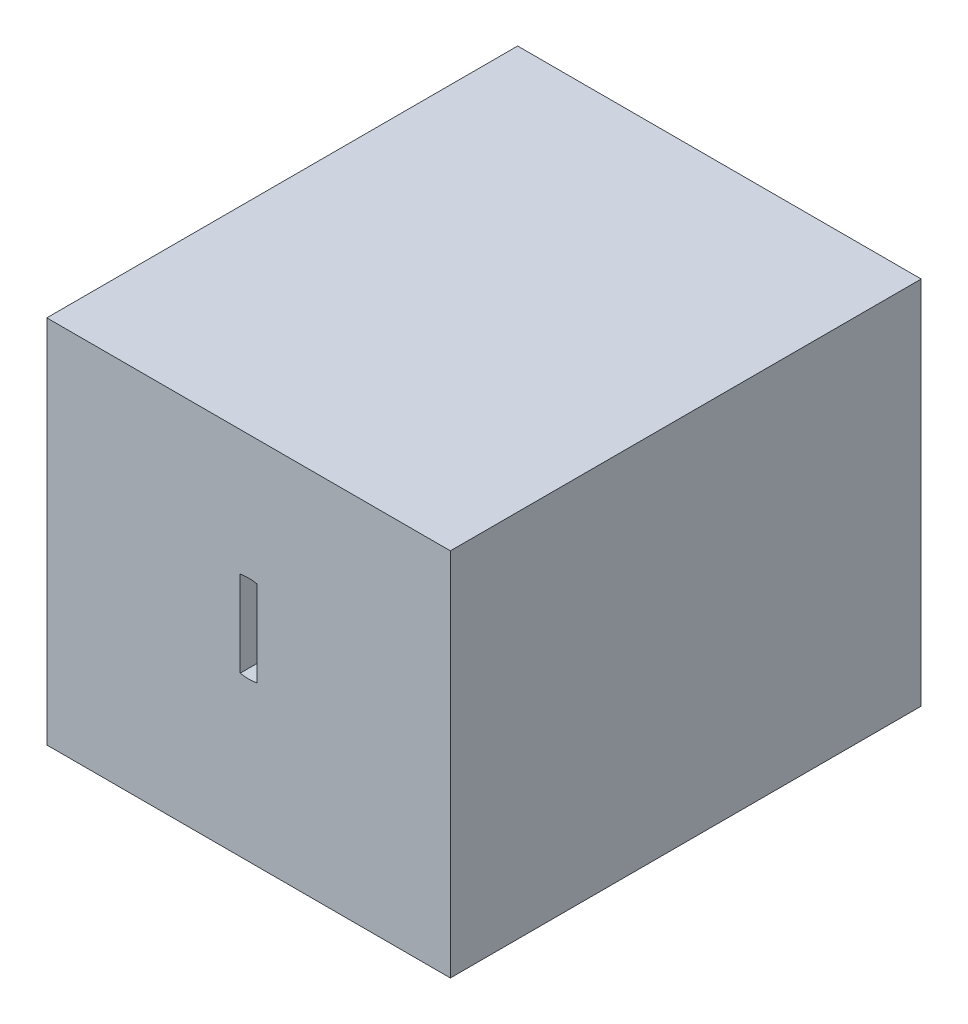
ISO-10303-21;
HEADER;
FILE_DESCRIPTION(('STEP AP214'),'2;1');
FILE_NAME('part.step','',(''),(''),'','','');
FILE_SCHEMA(('AUTOMOTIVE_DESIGN { 1 0 10303 214 1 1 1 1 }'));
ENDSEC;
DATA;
#1=APPLICATION_CONTEXT('core data for automotive mechanical design processes');
#2=APPLICATION_PROTOCOL_DEFINITION('international standard','automotive_design',2000,#1);
#3=PRODUCT_CONTEXT('',#1,'mechanical');
#4=PRODUCT('Part','Part','',(#3));
#5=PRODUCT_RELATED_PRODUCT_CATEGORY('part','',(#4));
#6=PRODUCT_DEFINITION_FORMATION('','',#4);
#7=PRODUCT_DEFINITION_CONTEXT('part definition',#1,'design');
#8=PRODUCT_DEFINITION('design','',#6,#7);
#9=PRODUCT_DEFINITION_SHAPE('','',#8);
#10=(LENGTH_UNIT() NAMED_UNIT(*) SI_UNIT(.MILLI.,.METRE.));
#11=(NAMED_UNIT(*) PLANE_ANGLE_UNIT() SI_UNIT($,.RADIAN.));
#12=(NAMED_UNIT(*) SI_UNIT($,.STERADIAN.) SOLID_ANGLE_UNIT());
#13=UNCERTAINTY_MEASURE_WITH_UNIT(LENGTH_MEASURE(1.E-05),#10,'distance_accuracy_value','');
#14=(GEOMETRIC_REPRESENTATION_CONTEXT(3) GLOBAL_UNCERTAINTY_ASSIGNED_CONTEXT((#13)) GLOBAL_UNIT_ASSIGNED_CONTEXT((#10,
#11,#12)) REPRESENTATION_CONTEXT('',''));
#15=CARTESIAN_POINT('',(0.,0.,0.));
#16=DIRECTION('',(0.,0.,1.));
#17=DIRECTION('',(1.,0.,0.));
#18=AXIS2_PLACEMENT_3D('',#15,#16,#17);
#19=CARTESIAN_POINT('',(-32.8183082101523,-7.19214017713193,-54.7013246195609));
#20=DIRECTION('',(0.,-1.,0.));
#21=DIRECTION('',(0.,0.,-1.));
#22=AXIS2_PLACEMENT_3D('',#19,#20,#21);
#23=PLANE('',#22);
#24=DIRECTION('',(-1.,0.,0.));
#25=VECTOR('',#24,1.);
#26=CARTESIAN_POINT('',(-32.8183082101523,-7.19214017713193,-62.2013246195609));
#27=LINE('',#26,#25);
#28=CARTESIAN_POINT('',(-32.8183082101523,-7.19214017713193,-62.2013246195609));
#29=VERTEX_POINT('',#28);
#30=CARTESIAN_POINT('',(-33.8933082101523,-7.19214017713193,-62.2013246195608));
#31=VERTEX_POINT('',#30);
#32=EDGE_CURVE('E422',#29,#31,#27,.T.);
#33=ORIENTED_EDGE('',*,*,#32,.T.);
#34=DIRECTION('',(0.,0.,1.));
#35=VECTOR('',#34,1.);
#36=CARTESIAN_POINT('',(-33.8933082101523,-7.19214017713193,-58.7013246195608));
#37=LINE('',#36,#35);
#38=CARTESIAN_POINT('',(-33.8933082101523,-7.19214017713193,-58.7013246195608));
#39=VERTEX_POINT('',#38);
#40=EDGE_CURVE('E282',#31,#39,#37,.T.);
#41=ORIENTED_EDGE('',*,*,#40,.T.);
#42=DIRECTION('',(0.,0.,-1.));
#43=VECTOR('',#42,1.);
#44=CARTESIAN_POINT('',(-33.8933082101523,-7.19214017713193,-54.7013246195609));
#45=LINE('',#44,#43);
#46=CARTESIAN_POINT('',(-33.8933082101523,-7.19214017713193,-54.7013246195608));
#47=VERTEX_POINT('',#46);
#48=EDGE_CURVE('E368',#47,#39,#45,.T.);
#49=ORIENTED_EDGE('',*,*,#48,.F.);
#50=DIRECTION('',(-1.,0.,0.));
#51=VECTOR('',#50,1.);
#52=CARTESIAN_POINT('',(-32.8183082101523,-7.19214017713193,-54.7013246195609));
#53=LINE('',#52,#51);
#54=CARTESIAN_POINT('',(-32.8183082101523,-7.19214017713193,-54.7013246195609));
#55=VERTEX_POINT('',#54);
#56=EDGE_CURVE('E398',#55,#47,#53,.T.);
#57=ORIENTED_EDGE('',*,*,#56,.F.);
#58=DIRECTION('',(0.,0.,-1.));
#59=VECTOR('',#58,1.);
#60=CARTESIAN_POINT('',(-32.8183082101523,-7.19214017713193,-54.7013246195609));
#61=LINE('',#60,#59);
#62=EDGE_CURVE('E445',#55,#29,#61,.T.);
#63=ORIENTED_EDGE('',*,*,#62,.T.);
#64=EDGE_LOOP('',(#33,#41,#49,#57,#63));
#65=FACE_BOUND('',#64,.T.);
#66=ADVANCED_FACE('F37',(#65),#23,.F.);
#67=DIRECTION('',(0.,0.,1.));
#68=VECTOR('',#67,1.);
#69=CARTESIAN_POINT('',(-38.0933082101523,-7.19214017713193,-54.7013246195609));
#70=LINE('',#69,#68);
#71=CARTESIAN_POINT('',(-38.0933082101523,-7.19214017713193,-58.7013246195608));
#72=VERTEX_POINT('',#71);
#73=CARTESIAN_POINT('',(-38.0933082101523,-7.19214017713193,-54.7013246195609));
#74=VERTEX_POINT('',#73);
#75=EDGE_CURVE('E373',#72,#74,#70,.T.);
#76=ORIENTED_EDGE('',*,*,#75,.F.);
#77=DIRECTION('',(0.,0.,-1.));
#78=VECTOR('',#77,1.);
#79=CARTESIAN_POINT('',(-38.0933082101523,-7.19214017713193,-58.7013246195608));
#80=LINE('',#79,#78);
#81=CARTESIAN_POINT('',(-38.0933082101523,-7.19214017713193,-62.2013246195608));
#82=VERTEX_POINT('',#81);
#83=EDGE_CURVE('E294',#72,#82,#80,.T.);
#84=ORIENTED_EDGE('',*,*,#83,.T.);
#85=CARTESIAN_POINT('',(-39.1683082101523,-7.19214017713193,-62.2013246195609));
#86=VERTEX_POINT('',#85);
#87=EDGE_CURVE('E421',#82,#86,#27,.T.);
#88=ORIENTED_EDGE('',*,*,#87,.T.);
#89=DIRECTION('',(0.,0.,-1.));
#90=VECTOR('',#89,1.);
#91=CARTESIAN_POINT('',(-39.1683082101523,-7.19214017713193,-54.7013246195609));
#92=LINE('',#91,#90);
#93=CARTESIAN_POINT('',(-39.1683082101523,-7.19214017713193,-54.7013246195609));
#94=VERTEX_POINT('',#93);
#95=EDGE_CURVE('E442',#94,#86,#92,.T.);
#96=ORIENTED_EDGE('',*,*,#95,.F.);
#97=EDGE_CURVE('E397',#74,#94,#53,.T.);
#98=ORIENTED_EDGE('',*,*,#97,.F.);
#99=EDGE_LOOP('',(#76,#84,#88,#96,#98));
#100=FACE_BOUND('',#99,.T.);
#101=ADVANCED_FACE('F535',(#100),#23,.F.);
#102=DIRECTION('',(-1.,0.,0.));
#103=VECTOR('',#102,1.);
#104=CARTESIAN_POINT('',(-32.8183082101523,-7.19214017713193,-58.7013246195608));
#105=LINE('',#104,#103);
#106=CARTESIAN_POINT('',(-34.2933082101523,-7.19214017713193,-58.7013246195608));
#107=VERTEX_POINT('',#106);
#108=CARTESIAN_POINT('',(-37.6933082101523,-7.19214017713193,-58.7013246195608));
#109=VERTEX_POINT('',#108);
#110=EDGE_CURVE('E376',#107,#109,#105,.T.);
#111=ORIENTED_EDGE('',*,*,#110,.F.);
#112=DIRECTION('',(0.,0.,-1.));
#113=VECTOR('',#112,1.);
#114=CARTESIAN_POINT('',(-34.2933082101523,-7.19214017713193,-58.7013246195608));
#115=LINE('',#114,#113);
#116=CARTESIAN_POINT('',(-34.2933082101523,-7.19214017713193,-62.2013246195608));
#117=VERTEX_POINT('',#116);
#118=EDGE_CURVE('E277',#107,#117,#115,.T.);
#119=ORIENTED_EDGE('',*,*,#118,.T.);
#120=CARTESIAN_POINT('',(-37.6933082101523,-7.19214017713193,-62.2013246195608));
#121=VERTEX_POINT('',#120);
#122=EDGE_CURVE('E426',#117,#121,#27,.T.);
#123=ORIENTED_EDGE('',*,*,#122,.T.);
#124=DIRECTION('',(0.,0.,1.));
#125=VECTOR('',#124,1.);
#126=CARTESIAN_POINT('',(-37.6933082101523,-7.19214017713193,-58.7013246195608));
#127=LINE('',#126,#125);
#128=EDGE_CURVE('E300',#121,#109,#127,.T.);
#129=ORIENTED_EDGE('',*,*,#128,.T.);
#130=EDGE_LOOP('',(#111,#119,#123,#129));
#131=FACE_BOUND('',#130,.T.);
#132=ADVANCED_FACE('F497',(#131),#23,.F.);
#133=CARTESIAN_POINT('',(-33.8183082101523,-0.842140177131929,-54.7013246195609));
#134=DIRECTION('',(0.,1.,0.));
#135=DIRECTION('',(0.,0.,1.));
#136=AXIS2_PLACEMENT_3D('',#133,#134,#135);
#137=PLANE('',#136);
#138=DIRECTION('',(0.,0.,-1.));
#139=VECTOR('',#138,1.);
#140=CARTESIAN_POINT('',(-38.0933082101523,-0.842140177131929,-54.7013246195609));
#141=LINE('',#140,#139);
#142=CARTESIAN_POINT('',(-38.0933082101523,-0.842140177131929,-54.7013246195608));
#143=VERTEX_POINT('',#142);
#144=CARTESIAN_POINT('',(-38.0933082101523,-0.842140177131929,-58.7013246195608));
#145=VERTEX_POINT('',#144);
#146=EDGE_CURVE('E371',#143,#145,#141,.T.);
#147=ORIENTED_EDGE('',*,*,#146,.F.);
#148=DIRECTION('',(1.,0.,0.));
#149=VECTOR('',#148,1.);
#150=CARTESIAN_POINT('',(-38.1683082101523,-0.842140177131929,-54.7013246195609));
#151=LINE('',#150,#149);
#152=CARTESIAN_POINT('',(-39.1683082101523,-0.842140177131929,-54.7013246195609));
#153=VERTEX_POINT('',#152);
#154=EDGE_CURVE('E385',#153,#143,#151,.T.);
#155=ORIENTED_EDGE('',*,*,#154,.F.);
#156=DIRECTION('',(0.,0.,-1.));
#157=VECTOR('',#156,1.);
#158=CARTESIAN_POINT('',(-39.1683082101523,-0.842140177131929,-54.7013246195609));
#159=LINE('',#158,#157);
#160=CARTESIAN_POINT('',(-39.1683082101523,-0.842140177131929,-62.2013246195609));
#161=VERTEX_POINT('',#160);
#162=EDGE_CURVE('E434',#153,#161,#159,.T.);
#163=ORIENTED_EDGE('',*,*,#162,.T.);
#164=DIRECTION('',(1.,0.,0.));
#165=VECTOR('',#164,1.);
#166=CARTESIAN_POINT('',(-33.8183082101523,-0.842140177131929,-62.2013246195609));
#167=LINE('',#166,#165);
#168=CARTESIAN_POINT('',(-32.8183082101523,-0.842140177131929,-62.2013246195609));
#169=VERTEX_POINT('',#168);
#170=EDGE_CURVE('E384',#161,#169,#167,.T.);
#171=ORIENTED_EDGE('',*,*,#170,.T.);
#172=DIRECTION('',(0.,0.,-1.));
#173=VECTOR('',#172,1.);
#174=CARTESIAN_POINT('',(-32.8183082101523,-0.842140177131929,-54.7013246195609));
#175=LINE('',#174,#173);
#176=CARTESIAN_POINT('',(-32.8183082101523,-0.842140177131929,-54.7013246195609));
#177=VERTEX_POINT('',#176);
#178=EDGE_CURVE('E409',#177,#169,#175,.T.);
#179=ORIENTED_EDGE('',*,*,#178,.F.);
#180=CARTESIAN_POINT('',(-33.8933082101523,-0.842140177131929,-54.7013246195609));
#181=VERTEX_POINT('',#180);
#182=EDGE_CURVE('E389',#181,#177,#151,.T.);
#183=ORIENTED_EDGE('',*,*,#182,.F.);
#184=DIRECTION('',(0.,0.,1.));
#185=VECTOR('',#184,1.);
#186=CARTESIAN_POINT('',(-33.8933082101523,-0.842140177131929,-54.7013246195609));
#187=LINE('',#186,#185);
#188=CARTESIAN_POINT('',(-33.8933082101523,-0.842140177131929,-58.7013246195608));
#189=VERTEX_POINT('',#188);
#190=EDGE_CURVE('E343',#189,#181,#187,.T.);
#191=ORIENTED_EDGE('',*,*,#190,.F.);
#192=DIRECTION('',(1.,0.,0.));
#193=VECTOR('',#192,1.);
#194=CARTESIAN_POINT('',(-33.8183082101523,-0.842140177131929,-58.7013246195608));
#195=LINE('',#194,#193);
#196=EDGE_CURVE('E454',#145,#189,#195,.T.);
#197=ORIENTED_EDGE('',*,*,#196,.F.);
#198=EDGE_LOOP('',(#147,#155,#163,#171,#179,#183,#191,#197));
#199=FACE_BOUND('',#198,.T.);
#200=ADVANCED_FACE('F552',(#199),#137,.F.);
#201=CARTESIAN_POINT('',(-35.9933082101523,0.982859822868071,25.7986753804392));
#202=DIRECTION('',(0.,-1.,0.));
#203=DIRECTION('',(0.,0.,-1.));
#204=AXIS2_PLACEMENT_3D('',#201,#202,#203);
#205=PLANE('',#204);
#206=DIRECTION('',(-1.,0.,0.));
#207=VECTOR('',#206,1.);
#208=CARTESIAN_POINT('',(-27.9933082101526,0.982859822868071,-62.2013246195609));
#209=LINE('',#208,#207);
#210=CARTESIAN_POINT('',(-29.9933082101523,0.982859822868071,-62.2013246195609));
#211=VERTEX_POINT('',#210);
#212=CARTESIAN_POINT('',(-41.9933082101523,0.982859822868071,-62.2013246195609));
#213=VERTEX_POINT('',#212);
#214=EDGE_CURVE('E452',#211,#213,#209,.T.);
#215=ORIENTED_EDGE('',*,*,#214,.T.);
#216=DIRECTION('',(0.,0.,1.));
#217=VECTOR('',#216,1.);
#218=CARTESIAN_POINT('',(-41.9933082101523,0.982859822868071,-48.2013246195609));
#219=LINE('',#218,#217);
#220=CARTESIAN_POINT('',(-41.9933082101523,0.982859822868071,-48.2013246195609));
#221=VERTEX_POINT('',#220);
#222=EDGE_CURVE('E249',#213,#221,#219,.T.);
#223=ORIENTED_EDGE('',*,*,#222,.T.);
#224=DIRECTION('',(1.,0.,0.));
#225=VECTOR('',#224,1.);
#226=CARTESIAN_POINT('',(-41.9933082101523,0.982859822868071,-48.2013246195609));
#227=LINE('',#226,#225);
#228=CARTESIAN_POINT('',(-29.9933082101523,0.982859822868071,-48.2013246195609));
#229=VERTEX_POINT('',#228);
#230=EDGE_CURVE('E257',#221,#229,#227,.T.);
#231=ORIENTED_EDGE('',*,*,#230,.T.);
#232=DIRECTION('',(0.,0.,-1.));
#233=VECTOR('',#232,1.);
#234=CARTESIAN_POINT('',(-29.9933082101523,0.982859822868071,-63.1020549371144));
#235=LINE('',#234,#233);
#236=EDGE_CURVE('E238',#229,#211,#235,.T.);
#237=ORIENTED_EDGE('',*,*,#236,.T.);
#238=EDGE_LOOP('',(#215,#223,#231,#237));
#239=FACE_BOUND('',#238,.T.);
#240=ADVANCED_FACE('F264',(#239),#205,.F.);
#241=CARTESIAN_POINT('',(-27.9933082101526,0.982859822868071,-62.2013246195609));
#242=DIRECTION('',(0.,0.,1.));
#243=DIRECTION('',(1.,0.,0.));
#244=AXIS2_PLACEMENT_3D('',#241,#242,#243);
#245=PLANE('',#244);
#246=ORIENTED_EDGE('',*,*,#122,.F.);
#247=DIRECTION('',(1.,0.,0.));
#248=VECTOR('',#247,1.);
#249=CARTESIAN_POINT('',(-27.9933082101526,-7.19214017713196,-62.2013246195609));
#250=LINE('',#249,#248);
#251=EDGE_CURVE('E477',#117,#31,#250,.T.);
#252=ORIENTED_EDGE('',*,*,#251,.T.);
#253=ORIENTED_EDGE('',*,*,#32,.F.);
#254=DIRECTION('',(0.,-1.,0.));
#255=VECTOR('',#254,1.);
#256=CARTESIAN_POINT('',(-32.8183082101523,-4.81714017713193,-62.2013246195609));
#257=LINE('',#256,#255);
#258=CARTESIAN_POINT('',(-32.8183082101523,-4.81714017713193,-62.2013246195609));
#259=VERTEX_POINT('',#258);
#260=EDGE_CURVE('E418',#259,#29,#257,.T.);
#261=ORIENTED_EDGE('',*,*,#260,.F.);
#262=CARTESIAN_POINT('',(-32.8183082101523,-4.01714017713193,-62.2013246195609));
#263=DIRECTION('',(0.,0.,-1.));
#264=DIRECTION('',(-1.,0.,0.));
#265=AXIS2_PLACEMENT_3D('',#262,#263,#264);
#266=CIRCLE('',#265,0.8);
#267=CARTESIAN_POINT('',(-32.8183082101523,-3.21714017713193,-62.2013246195609));
#268=VERTEX_POINT('',#267);
#269=EDGE_CURVE('E415',#268,#259,#266,.T.);
#270=ORIENTED_EDGE('',*,*,#269,.F.);
#271=DIRECTION('',(0.,-1.,0.));
#272=VECTOR('',#271,1.);
#273=CARTESIAN_POINT('',(-32.8183082101523,-1.84214017713193,-62.2013246195609));
#274=LINE('',#273,#272);
#275=EDGE_CURVE('E412',#169,#268,#274,.T.);
#276=ORIENTED_EDGE('',*,*,#275,.F.);
#277=ORIENTED_EDGE('',*,*,#170,.F.);
#278=DIRECTION('',(0.,1.,0.));
#279=VECTOR('',#278,1.);
#280=CARTESIAN_POINT('',(-39.1683082101523,-0.842140177131929,-62.2013246195609));
#281=LINE('',#280,#279);
#282=CARTESIAN_POINT('',(-39.1683082101523,-3.21714017713193,-62.2013246195609));
#283=VERTEX_POINT('',#282);
#284=EDGE_CURVE('E432',#283,#161,#281,.T.);
#285=ORIENTED_EDGE('',*,*,#284,.F.);
#286=CARTESIAN_POINT('',(-39.1683082101523,-4.01714017713193,-62.2013246195609));
#287=DIRECTION('',(0.,0.,-1.));
#288=DIRECTION('',(1.,0.,0.));
#289=AXIS2_PLACEMENT_3D('',#286,#287,#288);
#290=CIRCLE('',#289,0.8);
#291=CARTESIAN_POINT('',(-39.1683082101523,-4.81714017713193,-62.2013246195609));
#292=VERTEX_POINT('',#291);
#293=EDGE_CURVE('E429',#292,#283,#290,.T.);
#294=ORIENTED_EDGE('',*,*,#293,.F.);
#295=DIRECTION('',(0.,1.,0.));
#296=VECTOR('',#295,1.);
#297=CARTESIAN_POINT('',(-39.1683082101523,-4.81714017713193,-62.2013246195609));
#298=LINE('',#297,#296);
#299=EDGE_CURVE('E425',#86,#292,#298,.T.);
#300=ORIENTED_EDGE('',*,*,#299,.F.);
#301=ORIENTED_EDGE('',*,*,#87,.F.);
#302=DIRECTION('',(1.,0.,0.));
#303=VECTOR('',#302,1.);
#304=CARTESIAN_POINT('',(-27.9933082101526,-7.19214017713196,-62.2013246195609));
#305=LINE('',#304,#303);
#306=EDGE_CURVE('E474',#82,#121,#305,.T.);
#307=ORIENTED_EDGE('',*,*,#306,.T.);
#308=EDGE_LOOP('',(#246,#252,#253,#261,#270,#276,#277,#285,#294,#300,#301,#307));
#309=FACE_BOUND('',#308,.T.);
#310=DIRECTION('',(-1.,0.,0.));
#311=VECTOR('',#310,1.);
#312=CARTESIAN_POINT('',(-27.9933082101526,-10.0171401771319,-62.2013246195609));
#313=LINE('',#312,#311);
#314=CARTESIAN_POINT('',(-29.9933082101523,-10.0171401771319,-62.2013246195609));
#315=VERTEX_POINT('',#314);
#316=CARTESIAN_POINT('',(-41.9933082101523,-10.0171401771319,-62.2013246195609));
#317=VERTEX_POINT('',#316);
#318=EDGE_CURVE('E437',#315,#317,#313,.T.);
#319=ORIENTED_EDGE('',*,*,#318,.T.);
#320=DIRECTION('',(0.,1.,0.));
#321=VECTOR('',#320,1.);
#322=CARTESIAN_POINT('',(-41.9933082101523,0.982859822868071,-62.2013246195609));
#323=LINE('',#322,#321);
#324=EDGE_CURVE('E274',#317,#213,#323,.T.);
#325=ORIENTED_EDGE('',*,*,#324,.T.);
#326=ORIENTED_EDGE('',*,*,#214,.F.);
#327=DIRECTION('',(0.,-1.,0.));
#328=VECTOR('',#327,1.);
#329=CARTESIAN_POINT('',(-29.9933082101523,0.982859822868071,-62.2013246195609));
#330=LINE('',#329,#328);
#331=EDGE_CURVE('E244',#211,#315,#330,.T.);
#332=ORIENTED_EDGE('',*,*,#331,.T.);
#333=EDGE_LOOP('',(#319,#325,#326,#332));
#334=FACE_BOUND('',#333,.T.);
#335=ADVANCED_FACE('F499',(#309,#334),#245,.F.);
#336=CARTESIAN_POINT('',(-35.9933082101523,-10.0171401771319,25.7986753804392));
#337=DIRECTION('',(0.,-1.,0.));
#338=DIRECTION('',(0.,0.,-1.));
#339=AXIS2_PLACEMENT_3D('',#336,#337,#338);
#340=PLANE('',#339);
#341=DIRECTION('',(0.,0.,1.));
#342=VECTOR('',#341,1.);
#343=CARTESIAN_POINT('',(-41.9933082101523,-10.0171401771319,-48.2013246195609));
#344=LINE('',#343,#342);
#345=CARTESIAN_POINT('',(-41.9933082101523,-10.0171401771319,-48.2013246195609));
#346=VERTEX_POINT('',#345);
#347=EDGE_CURVE('E250',#317,#346,#344,.T.);
#348=ORIENTED_EDGE('',*,*,#347,.F.);
#349=ORIENTED_EDGE('',*,*,#318,.F.);
#350=DIRECTION('',(0.,0.,-1.));
#351=VECTOR('',#350,1.);
#352=CARTESIAN_POINT('',(-29.9933082101523,-10.0171401771319,-63.1020549371144));
#353=LINE('',#352,#351);
#354=CARTESIAN_POINT('',(-29.9933082101523,-10.0171401771319,-48.2013246195609));
#355=VERTEX_POINT('',#354);
#356=EDGE_CURVE('E266',#355,#315,#353,.T.);
#357=ORIENTED_EDGE('',*,*,#356,.F.);
#358=DIRECTION('',(1.,0.,0.));
#359=VECTOR('',#358,1.);
#360=CARTESIAN_POINT('',(-41.9933082101523,-10.0171401771319,-48.2013246195609));
#361=LINE('',#360,#359);
#362=EDGE_CURVE('E259',#346,#355,#361,.T.);
#363=ORIENTED_EDGE('',*,*,#362,.F.);
#364=EDGE_LOOP('',(#348,#349,#357,#363));
#365=FACE_BOUND('',#364,.T.);
#366=ADVANCED_FACE('F622',(#365),#340,.T.);
#367=CARTESIAN_POINT('',(-29.9933082101523,23.4550648771123,-60.2013246195608));
#368=DIRECTION('',(-1.,0.,0.));
#369=DIRECTION('',(0.,0.,1.));
#370=AXIS2_PLACEMENT_3D('',#367,#368,#369);
#371=PLANE('',#370);
#372=ORIENTED_EDGE('',*,*,#236,.F.);
#373=DIRECTION('',(0.,-1.,0.));
#374=VECTOR('',#373,1.);
#375=CARTESIAN_POINT('',(-29.9933082101523,0.982859822868071,-48.2013246195609));
#376=LINE('',#375,#374);
#377=EDGE_CURVE('E241',#229,#355,#376,.T.);
#378=ORIENTED_EDGE('',*,*,#377,.T.);
#379=ORIENTED_EDGE('',*,*,#356,.T.);
#380=ORIENTED_EDGE('',*,*,#331,.F.);
#381=EDGE_LOOP('',(#372,#378,#379,#380));
#382=FACE_BOUND('',#381,.T.);
#383=ADVANCED_FACE('F240',(#382),#371,.F.);
#384=CARTESIAN_POINT('',(-39.4933082101523,23.4550648771123,-48.2013246195609));
#385=DIRECTION('',(0.,0.,-1.));
#386=DIRECTION('',(-1.,0.,0.));
#387=AXIS2_PLACEMENT_3D('',#384,#385,#386);
#388=PLANE('',#387);
#389=ORIENTED_EDGE('',*,*,#377,.F.);
#390=ORIENTED_EDGE('',*,*,#230,.F.);
#391=DIRECTION('',(0.,-1.,0.));
#392=VECTOR('',#391,1.);
#393=CARTESIAN_POINT('',(-41.9933082101523,0.982859822868071,-48.2013246195609));
#394=LINE('',#393,#392);
#395=EDGE_CURVE('E261',#221,#346,#394,.T.);
#396=ORIENTED_EDGE('',*,*,#395,.T.);
#397=ORIENTED_EDGE('',*,*,#362,.T.);
#398=EDGE_LOOP('',(#389,#390,#396,#397));
#399=FACE_BOUND('',#398,.T.);
#400=DIRECTION('',(0.,-1.,0.));
#401=VECTOR('',#400,1.);
#402=CARTESIAN_POINT('',(-35.7433082101523,-0.0171401771319295,-48.2013246195609));
#403=LINE('',#402,#401);
#404=CARTESIAN_POINT('',(-35.7433082101523,-2.74140509491462,-48.2013246195609));
#405=VERTEX_POINT('',#404);
#406=CARTESIAN_POINT('',(-35.7433082101523,-5.29287525934924,-48.2013246195609));
#407=VERTEX_POINT('',#406);
#408=EDGE_CURVE('E313',#405,#407,#403,.T.);
#409=ORIENTED_EDGE('',*,*,#408,.T.);
#410=CARTESIAN_POINT('',(-35.9933082101523,-4.01714017713193,-48.2013246195609));
#411=DIRECTION('',(0.,0.,-1.));
#412=DIRECTION('',(-1.,0.,0.));
#413=AXIS2_PLACEMENT_3D('',#410,#411,#412);
#414=CIRCLE('',#413,1.3);
#415=CARTESIAN_POINT('',(-36.2433082101523,-5.29287525934924,-48.2013246195609));
#416=VERTEX_POINT('',#415);
#417=EDGE_CURVE('E379',#416,#407,#414,.F.);
#418=ORIENTED_EDGE('',*,*,#417,.F.);
#419=DIRECTION('',(0.,1.,0.));
#420=VECTOR('',#419,1.);
#421=CARTESIAN_POINT('',(-36.2433082101523,-0.0171401771319295,-48.2013246195609));
#422=LINE('',#421,#420);
#423=CARTESIAN_POINT('',(-36.2433082101523,-2.74140509491462,-48.2013246195609));
#424=VERTEX_POINT('',#423);
#425=EDGE_CURVE('E319',#416,#424,#422,.T.);
#426=ORIENTED_EDGE('',*,*,#425,.T.);
#427=EDGE_CURVE('E378',#405,#424,#414,.F.);
#428=ORIENTED_EDGE('',*,*,#427,.F.);
#429=EDGE_LOOP('',(#409,#418,#426,#428));
#430=FACE_BOUND('',#429,.T.);
#431=ADVANCED_FACE('F254',(#399,#430),#388,.F.);
#432=CARTESIAN_POINT('',(-41.9933082101523,23.4550648771123,-60.2013246195608));
#433=DIRECTION('',(1.,0.,0.));
#434=DIRECTION('',(0.,0.,-1.));
#435=AXIS2_PLACEMENT_3D('',#432,#433,#434);
#436=PLANE('',#435);
#437=ORIENTED_EDGE('',*,*,#395,.F.);
#438=ORIENTED_EDGE('',*,*,#222,.F.);
#439=ORIENTED_EDGE('',*,*,#324,.F.);
#440=ORIENTED_EDGE('',*,*,#347,.T.);
#441=EDGE_LOOP('',(#437,#438,#439,#440));
#442=FACE_BOUND('',#441,.T.);
#443=ADVANCED_FACE('F625',(#442),#436,.F.);
#444=CARTESIAN_POINT('',(-39.1683082101523,-0.842140177131929,-54.7013246195609));
#445=DIRECTION('',(-1.,0.,0.));
#446=DIRECTION('',(0.,-1.,0.));
#447=AXIS2_PLACEMENT_3D('',#444,#445,#446);
#448=PLANE('',#447);
#449=ORIENTED_EDGE('',*,*,#284,.T.);
#450=ORIENTED_EDGE('',*,*,#162,.F.);
#451=DIRECTION('',(0.,1.,0.));
#452=VECTOR('',#451,1.);
#453=CARTESIAN_POINT('',(-39.1683082101523,-1.84214017713193,-54.7013246195609));
#454=LINE('',#453,#452);
#455=CARTESIAN_POINT('',(-39.1683082101523,-3.21714017713193,-54.7013246195609));
#456=VERTEX_POINT('',#455);
#457=EDGE_CURVE('E407',#456,#153,#454,.T.);
#458=ORIENTED_EDGE('',*,*,#457,.F.);
#459=DIRECTION('',(0.,0.,-1.));
#460=VECTOR('',#459,1.);
#461=CARTESIAN_POINT('',(-39.1683082101523,-3.21714017713193,-54.7013246195609));
#462=LINE('',#461,#460);
#463=EDGE_CURVE('E438',#456,#283,#462,.T.);
#464=ORIENTED_EDGE('',*,*,#463,.T.);
#465=EDGE_LOOP('',(#449,#450,#458,#464));
#466=FACE_BOUND('',#465,.T.);
#467=ADVANCED_FACE('F547',(#466),#448,.F.);
#468=CARTESIAN_POINT('',(-39.1683082101523,-4.01714017713193,-54.7013246195609));
#469=DIRECTION('',(0.,0.,-1.));
#470=DIRECTION('',(-1.,0.,0.));
#471=AXIS2_PLACEMENT_3D('',#468,#469,#470);
#472=CYLINDRICAL_SURFACE('',#471,0.8);
#473=ORIENTED_EDGE('',*,*,#293,.T.);
#474=ORIENTED_EDGE('',*,*,#463,.F.);
#475=CARTESIAN_POINT('',(-39.1683082101523,-4.01714017713193,-54.7013246195609));
#476=DIRECTION('',(0.,0.,-1.));
#477=DIRECTION('',(1.,0.,0.));
#478=AXIS2_PLACEMENT_3D('',#475,#476,#477);
#479=CIRCLE('',#478,0.8);
#480=CARTESIAN_POINT('',(-39.1683082101523,-4.81714017713193,-54.7013246195609));
#481=VERTEX_POINT('',#480);
#482=EDGE_CURVE('E404',#481,#456,#479,.T.);
#483=ORIENTED_EDGE('',*,*,#482,.F.);
#484=DIRECTION('',(0.,0.,-1.));
#485=VECTOR('',#484,1.);
#486=CARTESIAN_POINT('',(-39.1683082101523,-4.81714017713193,-54.7013246195609));
#487=LINE('',#486,#485);
#488=EDGE_CURVE('E440',#481,#292,#487,.T.);
#489=ORIENTED_EDGE('',*,*,#488,.T.);
#490=EDGE_LOOP('',(#473,#474,#483,#489));
#491=FACE_BOUND('',#490,.T.);
#492=ADVANCED_FACE('F542',(#491),#472,.F.);
#493=CARTESIAN_POINT('',(-39.1683082101523,-4.81714017713193,-54.7013246195609));
#494=DIRECTION('',(-1.,0.,0.));
#495=DIRECTION('',(0.,-1.,0.));
#496=AXIS2_PLACEMENT_3D('',#493,#494,#495);
#497=PLANE('',#496);
#498=ORIENTED_EDGE('',*,*,#299,.T.);
#499=ORIENTED_EDGE('',*,*,#488,.F.);
#500=DIRECTION('',(0.,1.,0.));
#501=VECTOR('',#500,1.);
#502=CARTESIAN_POINT('',(-39.1683082101523,-4.81714017713193,-54.7013246195609));
#503=LINE('',#502,#501);
#504=EDGE_CURVE('E401',#94,#481,#503,.T.);
#505=ORIENTED_EDGE('',*,*,#504,.F.);
#506=ORIENTED_EDGE('',*,*,#95,.T.);
#507=EDGE_LOOP('',(#498,#499,#505,#506));
#508=FACE_BOUND('',#507,.T.);
#509=ADVANCED_FACE('F538',(#508),#497,.F.);
#510=CARTESIAN_POINT('',(-32.8183082101523,-4.81714017713193,-54.7013246195609));
#511=DIRECTION('',(1.,0.,0.));
#512=DIRECTION('',(0.,0.,-1.));
#513=AXIS2_PLACEMENT_3D('',#510,#511,#512);
#514=PLANE('',#513);
#515=ORIENTED_EDGE('',*,*,#260,.T.);
#516=ORIENTED_EDGE('',*,*,#62,.F.);
#517=DIRECTION('',(0.,-1.,0.));
#518=VECTOR('',#517,1.);
#519=CARTESIAN_POINT('',(-32.8183082101523,-4.81714017713193,-54.7013246195609));
#520=LINE('',#519,#518);
#521=CARTESIAN_POINT('',(-32.8183082101523,-4.81714017713193,-54.7013246195609));
#522=VERTEX_POINT('',#521);
#523=EDGE_CURVE('E394',#522,#55,#520,.T.);
#524=ORIENTED_EDGE('',*,*,#523,.F.);
#525=DIRECTION('',(0.,0.,-1.));
#526=VECTOR('',#525,1.);
#527=CARTESIAN_POINT('',(-32.8183082101523,-4.81714017713193,-54.7013246195609));
#528=LINE('',#527,#526);
#529=EDGE_CURVE('E447',#522,#259,#528,.T.);
#530=ORIENTED_EDGE('',*,*,#529,.T.);
#531=EDGE_LOOP('',(#515,#516,#524,#530));
#532=FACE_BOUND('',#531,.T.);
#533=ADVANCED_FACE('F583',(#532),#514,.F.);
#534=CARTESIAN_POINT('',(-32.8183082101523,-4.01714017713193,-54.7013246195609));
#535=DIRECTION('',(0.,0.,-1.));
#536=DIRECTION('',(-1.,0.,0.));
#537=AXIS2_PLACEMENT_3D('',#534,#535,#536);
#538=CYLINDRICAL_SURFACE('',#537,0.8);
#539=ORIENTED_EDGE('',*,*,#269,.T.);
#540=ORIENTED_EDGE('',*,*,#529,.F.);
#541=CARTESIAN_POINT('',(-32.8183082101523,-4.01714017713193,-54.7013246195609));
#542=DIRECTION('',(0.,0.,-1.));
#543=DIRECTION('',(-1.,0.,0.));
#544=AXIS2_PLACEMENT_3D('',#541,#542,#543);
#545=CIRCLE('',#544,0.8);
#546=CARTESIAN_POINT('',(-32.8183082101523,-3.21714017713193,-54.7013246195609));
#547=VERTEX_POINT('',#546);
#548=EDGE_CURVE('E391',#547,#522,#545,.T.);
#549=ORIENTED_EDGE('',*,*,#548,.F.);
#550=DIRECTION('',(0.,0.,-1.));
#551=VECTOR('',#550,1.);
#552=CARTESIAN_POINT('',(-32.8183082101523,-3.21714017713193,-54.7013246195609));
#553=LINE('',#552,#551);
#554=EDGE_CURVE('E449',#547,#268,#553,.T.);
#555=ORIENTED_EDGE('',*,*,#554,.T.);
#556=EDGE_LOOP('',(#539,#540,#549,#555));
#557=FACE_BOUND('',#556,.T.);
#558=ADVANCED_FACE('F579',(#557),#538,.F.);
#559=CARTESIAN_POINT('',(-32.8183082101523,-1.84214017713193,-54.7013246195609));
#560=DIRECTION('',(1.,0.,0.));
#561=DIRECTION('',(0.,1.,0.));
#562=AXIS2_PLACEMENT_3D('',#559,#560,#561);
#563=PLANE('',#562);
#564=ORIENTED_EDGE('',*,*,#275,.T.);
#565=ORIENTED_EDGE('',*,*,#554,.F.);
#566=DIRECTION('',(0.,-1.,0.));
#567=VECTOR('',#566,1.);
#568=CARTESIAN_POINT('',(-32.8183082101523,-0.842140177131929,-54.7013246195609));
#569=LINE('',#568,#567);
#570=EDGE_CURVE('E388',#177,#547,#569,.T.);
#571=ORIENTED_EDGE('',*,*,#570,.F.);
#572=ORIENTED_EDGE('',*,*,#178,.T.);
#573=EDGE_LOOP('',(#564,#565,#571,#572));
#574=FACE_BOUND('',#573,.T.);
#575=ADVANCED_FACE('F575',(#574),#563,.F.);
#576=CARTESIAN_POINT('',(-39.1683082101523,-4.01714017713193,-54.7013246195609));
#577=DIRECTION('',(0.,0.,1.));
#578=DIRECTION('',(1.,0.,0.));
#579=AXIS2_PLACEMENT_3D('',#576,#577,#578);
#580=PLANE('',#579);
#581=CARTESIAN_POINT('',(-35.9933082101523,-4.01714017713193,-54.7013246195609));
#582=DIRECTION('',(0.,0.,-1.));
#583=DIRECTION('',(-1.,0.,0.));
#584=AXIS2_PLACEMENT_3D('',#581,#582,#583);
#585=CIRCLE('',#584,1.3);
#586=CARTESIAN_POINT('',(-37.2933082101523,-4.01714017713193,-54.7013246195609));
#587=VERTEX_POINT('',#586);
#588=EDGE_CURVE('E381',#587,#587,#585,.T.);
#589=ORIENTED_EDGE('',*,*,#588,.F.);
#590=EDGE_LOOP('',(#589));
#591=FACE_BOUND('',#590,.T.);
#592=ORIENTED_EDGE('',*,*,#56,.T.);
#593=DIRECTION('',(0.,1.,0.));
#594=VECTOR('',#593,1.);
#595=CARTESIAN_POINT('',(-33.8933082101523,-13.7921401771319,-54.7013246195608));
#596=LINE('',#595,#594);
#597=CARTESIAN_POINT('',(-33.8933082101523,-7.59214017713193,-54.7013246195608));
#598=VERTEX_POINT('',#597);
#599=EDGE_CURVE('E353',#598,#47,#596,.T.);
#600=ORIENTED_EDGE('',*,*,#599,.F.);
#601=DIRECTION('',(-1.,0.,0.));
#602=VECTOR('',#601,1.);
#603=CARTESIAN_POINT('',(-38.0933082101523,-7.59214017713193,-54.7013246195608));
#604=LINE('',#603,#602);
#605=CARTESIAN_POINT('',(-38.0933082101523,-7.59214017713193,-54.7013246195608));
#606=VERTEX_POINT('',#605);
#607=EDGE_CURVE('E350',#598,#606,#604,.T.);
#608=ORIENTED_EDGE('',*,*,#607,.T.);
#609=DIRECTION('',(0.,1.,0.));
#610=VECTOR('',#609,1.);
#611=CARTESIAN_POINT('',(-38.0933082101523,-13.7921401771319,-54.7013246195608));
#612=LINE('',#611,#610);
#613=EDGE_CURVE('E364',#606,#74,#612,.T.);
#614=ORIENTED_EDGE('',*,*,#613,.T.);
#615=ORIENTED_EDGE('',*,*,#97,.T.);
#616=ORIENTED_EDGE('',*,*,#504,.T.);
#617=ORIENTED_EDGE('',*,*,#482,.T.);
#618=ORIENTED_EDGE('',*,*,#457,.T.);
#619=ORIENTED_EDGE('',*,*,#154,.T.);
#620=CARTESIAN_POINT('',(-38.0933082101523,-0.442140177131929,-54.7013246195608));
#621=VERTEX_POINT('',#620);
#622=EDGE_CURVE('E339',#143,#621,#612,.T.);
#623=ORIENTED_EDGE('',*,*,#622,.T.);
#624=DIRECTION('',(-1.,0.,0.));
#625=VECTOR('',#624,1.);
#626=CARTESIAN_POINT('',(-38.0933082101523,-0.442140177131929,-54.7013246195608));
#627=LINE('',#626,#625);
#628=CARTESIAN_POINT('',(-33.8933082101523,-0.442140177131929,-54.7013246195608));
#629=VERTEX_POINT('',#628);
#630=EDGE_CURVE('E336',#629,#621,#627,.T.);
#631=ORIENTED_EDGE('',*,*,#630,.F.);
#632=EDGE_CURVE('E362',#181,#629,#596,.T.);
#633=ORIENTED_EDGE('',*,*,#632,.F.);
#634=ORIENTED_EDGE('',*,*,#182,.T.);
#635=ORIENTED_EDGE('',*,*,#570,.T.);
#636=ORIENTED_EDGE('',*,*,#548,.T.);
#637=ORIENTED_EDGE('',*,*,#523,.T.);
#638=EDGE_LOOP('',(#592,#600,#608,#614,#615,#616,#617,#618,#619,#623,#631,#633,#634,#635,#636,#637));
#639=FACE_BOUND('',#638,.T.);
#640=ADVANCED_FACE('F523',(#591,#639),#580,.F.);
#641=CARTESIAN_POINT('',(-35.9933082101523,-4.01714017713193,62.7996753804392));
#642=DIRECTION('',(0.,0.,-1.));
#643=DIRECTION('',(-1.,0.,0.));
#644=AXIS2_PLACEMENT_3D('',#641,#642,#643);
#645=CYLINDRICAL_SURFACE('',#644,1.3);
#646=ORIENTED_EDGE('',*,*,#588,.T.);
#647=EDGE_LOOP('',(#646));
#648=FACE_BOUND('',#647,.T.);
#649=CARTESIAN_POINT('',(-35.9933082101523,-4.01714017713193,-49.2013246195609));
#650=DIRECTION('',(0.,0.,1.));
#651=DIRECTION('',(1.,0.,0.));
#652=AXIS2_PLACEMENT_3D('',#649,#650,#651);
#653=CIRCLE('',#652,1.3);
#654=CARTESIAN_POINT('',(-35.7433082101523,-2.74140509491462,-49.2013246195609));
#655=VERTEX_POINT('',#654);
#656=CARTESIAN_POINT('',(-35.7433082101523,-5.29287525934924,-49.2013246195609));
#657=VERTEX_POINT('',#656);
#658=EDGE_CURVE('E466',#655,#657,#653,.F.);
#659=ORIENTED_EDGE('',*,*,#658,.F.);
#660=DIRECTION('',(0.,0.,-1.));
#661=VECTOR('',#660,1.);
#662=CARTESIAN_POINT('',(-35.7433082101523,-2.74140509491462,62.7996753804392));
#663=LINE('',#662,#661);
#664=EDGE_CURVE('E471',#655,#405,#663,.F.);
#665=ORIENTED_EDGE('',*,*,#664,.T.);
#666=ORIENTED_EDGE('',*,*,#427,.T.);
#667=DIRECTION('',(0.,0.,-1.));
#668=VECTOR('',#667,1.);
#669=CARTESIAN_POINT('',(-36.2433082101523,-2.74140509491462,62.7996753804392));
#670=LINE('',#669,#668);
#671=CARTESIAN_POINT('',(-36.2433082101523,-2.74140509491462,-49.2013246195609));
#672=VERTEX_POINT('',#671);
#673=EDGE_CURVE('E461',#424,#672,#670,.T.);
#674=ORIENTED_EDGE('',*,*,#673,.T.);
#675=CARTESIAN_POINT('',(-35.9933082101523,-4.01714017713193,-49.2013246195609));
#676=DIRECTION('',(0.,0.,1.));
#677=DIRECTION('',(1.,0.,0.));
#678=AXIS2_PLACEMENT_3D('',#675,#676,#677);
#679=CIRCLE('',#678,1.3);
#680=CARTESIAN_POINT('',(-36.2433082101523,-5.29287525934924,-49.2013246195609));
#681=VERTEX_POINT('',#680);
#682=EDGE_CURVE('E458',#681,#672,#679,.F.);
#683=ORIENTED_EDGE('',*,*,#682,.F.);
#684=DIRECTION('',(0.,0.,-1.));
#685=VECTOR('',#684,1.);
#686=CARTESIAN_POINT('',(-36.2433082101523,-5.29287525934924,62.7996753804392));
#687=LINE('',#686,#685);
#688=EDGE_CURVE('E463',#681,#416,#687,.F.);
#689=ORIENTED_EDGE('',*,*,#688,.T.);
#690=ORIENTED_EDGE('',*,*,#417,.T.);
#691=DIRECTION('',(0.,0.,-1.));
#692=VECTOR('',#691,1.);
#693=CARTESIAN_POINT('',(-35.7433082101523,-5.29287525934924,62.7996753804392));
#694=LINE('',#693,#692);
#695=EDGE_CURVE('E469',#407,#657,#694,.T.);
#696=ORIENTED_EDGE('',*,*,#695,.T.);
#697=EDGE_LOOP('',(#659,#665,#666,#674,#683,#689,#690,#696));
#698=FACE_BOUND('',#697,.T.);
#699=ADVANCED_FACE('F749',(#648,#698),#645,.F.);
#700=CARTESIAN_POINT('',(-35.9933082101523,-0.442140177131929,25.7986753804392));
#701=DIRECTION('',(0.,-1.,0.));
#702=DIRECTION('',(0.,0.,-1.));
#703=AXIS2_PLACEMENT_3D('',#700,#701,#702);
#704=PLANE('',#703);
#705=DIRECTION('',(0.,0.,-1.));
#706=VECTOR('',#705,1.);
#707=CARTESIAN_POINT('',(-38.0933082101523,-0.442140177131929,-54.7013246195608));
#708=LINE('',#707,#706);
#709=CARTESIAN_POINT('',(-38.0933082101523,-0.442140177131929,-58.7013246195608));
#710=VERTEX_POINT('',#709);
#711=EDGE_CURVE('E325',#621,#710,#708,.T.);
#712=ORIENTED_EDGE('',*,*,#711,.T.);
#713=DIRECTION('',(1.,0.,0.));
#714=VECTOR('',#713,1.);
#715=CARTESIAN_POINT('',(-38.0933082101523,-0.442140177131929,-58.7013246195608));
#716=LINE('',#715,#714);
#717=CARTESIAN_POINT('',(-33.8933082101523,-0.442140177131929,-58.7013246195608));
#718=VERTEX_POINT('',#717);
#719=EDGE_CURVE('E330',#710,#718,#716,.T.);
#720=ORIENTED_EDGE('',*,*,#719,.T.);
#721=DIRECTION('',(0.,0.,1.));
#722=VECTOR('',#721,1.);
#723=CARTESIAN_POINT('',(-33.8933082101523,-0.442140177131929,-54.7013246195608));
#724=LINE('',#723,#722);
#725=EDGE_CURVE('E333',#718,#629,#724,.T.);
#726=ORIENTED_EDGE('',*,*,#725,.T.);
#727=ORIENTED_EDGE('',*,*,#630,.T.);
#728=EDGE_LOOP('',(#712,#720,#726,#727));
#729=FACE_BOUND('',#728,.T.);
#730=ADVANCED_FACE('F565',(#729),#704,.T.);
#731=CARTESIAN_POINT('',(-33.8933082101523,-13.7921401771319,-54.7013246195608));
#732=DIRECTION('',(-1.,0.,0.));
#733=DIRECTION('',(0.,0.,1.));
#734=AXIS2_PLACEMENT_3D('',#731,#732,#733);
#735=PLANE('',#734);
#736=ORIENTED_EDGE('',*,*,#190,.T.);
#737=ORIENTED_EDGE('',*,*,#632,.T.);
#738=ORIENTED_EDGE('',*,*,#725,.F.);
#739=DIRECTION('',(0.,1.,0.));
#740=VECTOR('',#739,1.);
#741=CARTESIAN_POINT('',(-33.8933082101523,-13.7921401771319,-58.7013246195608));
#742=LINE('',#741,#740);
#743=EDGE_CURVE('E357',#189,#718,#742,.T.);
#744=ORIENTED_EDGE('',*,*,#743,.F.);
#745=EDGE_LOOP('',(#736,#737,#738,#744));
#746=FACE_BOUND('',#745,.T.);
#747=ADVANCED_FACE('F570',(#746),#735,.T.);
#748=CARTESIAN_POINT('',(-38.0933082101523,-13.7921401771319,-58.7013246195608));
#749=DIRECTION('',(0.,0.,1.));
#750=DIRECTION('',(1.,0.,0.));
#751=AXIS2_PLACEMENT_3D('',#748,#749,#750);
#752=PLANE('',#751);
#753=ORIENTED_EDGE('',*,*,#196,.T.);
#754=ORIENTED_EDGE('',*,*,#743,.T.);
#755=ORIENTED_EDGE('',*,*,#719,.F.);
#756=DIRECTION('',(0.,1.,0.));
#757=VECTOR('',#756,1.);
#758=CARTESIAN_POINT('',(-38.0933082101523,-13.7921401771319,-58.7013246195608));
#759=LINE('',#758,#757);
#760=EDGE_CURVE('E358',#145,#710,#759,.T.);
#761=ORIENTED_EDGE('',*,*,#760,.F.);
#762=EDGE_LOOP('',(#753,#754,#755,#761));
#763=FACE_BOUND('',#762,.T.);
#764=ADVANCED_FACE('F561',(#763),#752,.T.);
#765=CARTESIAN_POINT('',(-38.0933082101523,-13.7921401771319,-54.7013246195608));
#766=DIRECTION('',(1.,0.,0.));
#767=DIRECTION('',(0.,0.,-1.));
#768=AXIS2_PLACEMENT_3D('',#765,#766,#767);
#769=PLANE('',#768);
#770=ORIENTED_EDGE('',*,*,#146,.T.);
#771=ORIENTED_EDGE('',*,*,#760,.T.);
#772=ORIENTED_EDGE('',*,*,#711,.F.);
#773=ORIENTED_EDGE('',*,*,#622,.F.);
#774=EDGE_LOOP('',(#770,#771,#772,#773));
#775=FACE_BOUND('',#774,.T.);
#776=ADVANCED_FACE('F557',(#775),#769,.T.);
#777=CARTESIAN_POINT('',(-33.8933082101523,-7.59214017713193,-58.7013246195608));
#778=VERTEX_POINT('',#777);
#779=EDGE_CURVE('E359',#778,#39,#742,.T.);
#780=ORIENTED_EDGE('',*,*,#779,.T.);
#781=DIRECTION('',(0.,-1.,0.));
#782=VECTOR('',#781,1.);
#783=CARTESIAN_POINT('',(-33.8933082101523,-6.99214017713193,-58.7013246195608));
#784=LINE('',#783,#782);
#785=CARTESIAN_POINT('',(-33.8933082101523,-6.99214017713193,-58.7013246195608));
#786=VERTEX_POINT('',#785);
#787=EDGE_CURVE('E292',#786,#39,#784,.T.);
#788=ORIENTED_EDGE('',*,*,#787,.F.);
#789=DIRECTION('',(-1.,0.,0.));
#790=VECTOR('',#789,1.);
#791=CARTESIAN_POINT('',(-33.8933082101523,-6.99214017713193,-58.7013246195608));
#792=LINE('',#791,#790);
#793=CARTESIAN_POINT('',(-34.2933082101523,-6.99214017713193,-58.7013246195608));
#794=VERTEX_POINT('',#793);
#795=EDGE_CURVE('E278',#786,#794,#792,.T.);
#796=ORIENTED_EDGE('',*,*,#795,.T.);
#797=DIRECTION('',(0.,-1.,0.));
#798=VECTOR('',#797,1.);
#799=CARTESIAN_POINT('',(-34.2933082101523,-6.99214017713193,-58.7013246195608));
#800=LINE('',#799,#798);
#801=EDGE_CURVE('E287',#794,#107,#800,.T.);
#802=ORIENTED_EDGE('',*,*,#801,.T.);
#803=ORIENTED_EDGE('',*,*,#110,.T.);
#804=DIRECTION('',(0.,-1.,0.));
#805=VECTOR('',#804,1.);
#806=CARTESIAN_POINT('',(-37.6933082101523,-6.99214017713193,-58.7013246195608));
#807=LINE('',#806,#805);
#808=CARTESIAN_POINT('',(-37.6933082101523,-6.99214017713193,-58.7013246195608));
#809=VERTEX_POINT('',#808);
#810=EDGE_CURVE('E305',#809,#109,#807,.T.);
#811=ORIENTED_EDGE('',*,*,#810,.F.);
#812=DIRECTION('',(-1.,0.,0.));
#813=VECTOR('',#812,1.);
#814=CARTESIAN_POINT('',(-38.0933082101523,-6.99214017713193,-58.7013246195608));
#815=LINE('',#814,#813);
#816=CARTESIAN_POINT('',(-38.0933082101523,-6.99214017713193,-58.7013246195608));
#817=VERTEX_POINT('',#816);
#818=EDGE_CURVE('E302',#809,#817,#815,.T.);
#819=ORIENTED_EDGE('',*,*,#818,.T.);
#820=DIRECTION('',(0.,-1.,0.));
#821=VECTOR('',#820,1.);
#822=CARTESIAN_POINT('',(-38.0933082101523,-6.99214017713193,-58.7013246195608));
#823=LINE('',#822,#821);
#824=EDGE_CURVE('E310',#817,#72,#823,.T.);
#825=ORIENTED_EDGE('',*,*,#824,.T.);
#826=CARTESIAN_POINT('',(-38.0933082101523,-7.59214017713193,-58.7013246195608));
#827=VERTEX_POINT('',#826);
#828=EDGE_CURVE('E354',#827,#72,#759,.T.);
#829=ORIENTED_EDGE('',*,*,#828,.F.);
#830=DIRECTION('',(1.,0.,0.));
#831=VECTOR('',#830,1.);
#832=CARTESIAN_POINT('',(-38.0933082101523,-7.59214017713193,-58.7013246195608));
#833=LINE('',#832,#831);
#834=EDGE_CURVE('E344',#827,#778,#833,.T.);
#835=ORIENTED_EDGE('',*,*,#834,.T.);
#836=EDGE_LOOP('',(#780,#788,#796,#802,#803,#811,#819,#825,#829,#835));
#837=FACE_BOUND('',#836,.T.);
#838=ADVANCED_FACE('F514',(#837),#752,.T.);
#839=ORIENTED_EDGE('',*,*,#75,.T.);
#840=ORIENTED_EDGE('',*,*,#613,.F.);
#841=DIRECTION('',(0.,0.,-1.));
#842=VECTOR('',#841,1.);
#843=CARTESIAN_POINT('',(-38.0933082101523,-7.59214017713193,-54.7013246195608));
#844=LINE('',#843,#842);
#845=EDGE_CURVE('E347',#606,#827,#844,.T.);
#846=ORIENTED_EDGE('',*,*,#845,.T.);
#847=ORIENTED_EDGE('',*,*,#828,.T.);
#848=EDGE_LOOP('',(#839,#840,#846,#847));
#849=FACE_BOUND('',#848,.T.);
#850=ADVANCED_FACE('F529',(#849),#769,.T.);
#851=ORIENTED_EDGE('',*,*,#48,.T.);
#852=ORIENTED_EDGE('',*,*,#779,.F.);
#853=DIRECTION('',(0.,0.,1.));
#854=VECTOR('',#853,1.);
#855=CARTESIAN_POINT('',(-33.8933082101523,-7.59214017713193,-54.7013246195608));
#856=LINE('',#855,#854);
#857=EDGE_CURVE('E340',#778,#598,#856,.T.);
#858=ORIENTED_EDGE('',*,*,#857,.T.);
#859=ORIENTED_EDGE('',*,*,#599,.T.);
#860=EDGE_LOOP('',(#851,#852,#858,#859));
#861=FACE_BOUND('',#860,.T.);
#862=ADVANCED_FACE('F520',(#861),#735,.T.);
#863=CARTESIAN_POINT('',(-32.8183082101523,-7.59214017713193,-54.7013246195609));
#864=DIRECTION('',(0.,-1.,0.));
#865=DIRECTION('',(0.,0.,-1.));
#866=AXIS2_PLACEMENT_3D('',#863,#864,#865);
#867=PLANE('',#866);
#868=ORIENTED_EDGE('',*,*,#607,.F.);
#869=ORIENTED_EDGE('',*,*,#857,.F.);
#870=ORIENTED_EDGE('',*,*,#834,.F.);
#871=ORIENTED_EDGE('',*,*,#845,.F.);
#872=EDGE_LOOP('',(#868,#869,#870,#871));
#873=FACE_BOUND('',#872,.T.);
#874=ADVANCED_FACE('F526',(#873),#867,.F.);
#875=CARTESIAN_POINT('',(-36.2433082101523,-0.0171401771319295,-49.2013246195609));
#876=DIRECTION('',(1.,0.,0.));
#877=DIRECTION('',(0.,1.,0.));
#878=AXIS2_PLACEMENT_3D('',#875,#876,#877);
#879=PLANE('',#878);
#880=ORIENTED_EDGE('',*,*,#688,.F.);
#881=DIRECTION('',(0.,1.,0.));
#882=VECTOR('',#881,1.);
#883=CARTESIAN_POINT('',(-36.2433082101523,-0.0171401771319295,-49.2013246195609));
#884=LINE('',#883,#882);
#885=EDGE_CURVE('E322',#681,#672,#884,.T.);
#886=ORIENTED_EDGE('',*,*,#885,.T.);
#887=ORIENTED_EDGE('',*,*,#673,.F.);
#888=ORIENTED_EDGE('',*,*,#425,.F.);
#889=EDGE_LOOP('',(#880,#886,#887,#888));
#890=FACE_BOUND('',#889,.T.);
#891=ADVANCED_FACE('F803',(#890),#879,.T.);
#892=CARTESIAN_POINT('',(-35.9933082101523,-10.0171401771319,-49.2013246195609));
#893=DIRECTION('',(0.,0.,1.));
#894=DIRECTION('',(1.,0.,0.));
#895=AXIS2_PLACEMENT_3D('',#892,#893,#894);
#896=PLANE('',#895);
#897=ORIENTED_EDGE('',*,*,#885,.F.);
#898=ORIENTED_EDGE('',*,*,#682,.T.);
#899=EDGE_LOOP('',(#897,#898));
#900=FACE_BOUND('',#899,.T.);
#901=ADVANCED_FACE('F810',(#900),#896,.F.);
#902=CARTESIAN_POINT('',(-35.7433082101523,-0.0171401771319295,-49.2013246195609));
#903=DIRECTION('',(-1.,0.,0.));
#904=DIRECTION('',(0.,-1.,0.));
#905=AXIS2_PLACEMENT_3D('',#902,#903,#904);
#906=PLANE('',#905);
#907=ORIENTED_EDGE('',*,*,#664,.F.);
#908=DIRECTION('',(0.,-1.,0.));
#909=VECTOR('',#908,1.);
#910=CARTESIAN_POINT('',(-35.7433082101523,-0.0171401771319295,-49.2013246195609));
#911=LINE('',#910,#909);
#912=EDGE_CURVE('E316',#655,#657,#911,.T.);
#913=ORIENTED_EDGE('',*,*,#912,.T.);
#914=ORIENTED_EDGE('',*,*,#695,.F.);
#915=ORIENTED_EDGE('',*,*,#408,.F.);
#916=EDGE_LOOP('',(#907,#913,#914,#915));
#917=FACE_BOUND('',#916,.T.);
#918=ADVANCED_FACE('F818',(#917),#906,.T.);
#919=CARTESIAN_POINT('',(-35.9933082101523,-10.0171401771319,-49.2013246195609));
#920=DIRECTION('',(0.,0.,1.));
#921=DIRECTION('',(1.,0.,0.));
#922=AXIS2_PLACEMENT_3D('',#919,#920,#921);
#923=PLANE('',#922);
#924=ORIENTED_EDGE('',*,*,#912,.F.);
#925=ORIENTED_EDGE('',*,*,#658,.T.);
#926=EDGE_LOOP('',(#924,#925));
#927=FACE_BOUND('',#926,.T.);
#928=ADVANCED_FACE('F599',(#927),#923,.F.);
#929=CARTESIAN_POINT('',(-38.0933082101523,-6.99214017713193,-58.7013246195608));
#930=DIRECTION('',(-1.,0.,0.));
#931=DIRECTION('',(0.,0.,1.));
#932=AXIS2_PLACEMENT_3D('',#929,#930,#931);
#933=PLANE('',#932);
#934=DIRECTION('',(0.,0.,-1.));
#935=VECTOR('',#934,1.);
#936=CARTESIAN_POINT('',(-38.0933082101523,-6.99214017713193,-58.7013246195608));
#937=LINE('',#936,#935);
#938=CARTESIAN_POINT('',(-38.0933082101523,-6.99214017713193,-62.0013246195608));
#939=VERTEX_POINT('',#938);
#940=EDGE_CURVE('E297',#817,#939,#937,.T.);
#941=ORIENTED_EDGE('',*,*,#940,.T.);
#942=DIRECTION('',(0.,0.707106781186547,0.707106781186548));
#943=VECTOR('',#942,1.);
#944=CARTESIAN_POINT('',(-38.0933082101523,-5.34214017713193,-60.3513246195608));
#945=LINE('',#944,#943);
#946=EDGE_CURVE('E12',#939,#82,#945,.F.);
#947=ORIENTED_EDGE('',*,*,#946,.T.);
#948=ORIENTED_EDGE('',*,*,#83,.F.);
#949=ORIENTED_EDGE('',*,*,#824,.F.);
#950=EDGE_LOOP('',(#941,#947,#948,#949));
#951=FACE_BOUND('',#950,.T.);
#952=ADVANCED_FACE('F587',(#951),#933,.T.);
#953=CARTESIAN_POINT('',(-37.6933082101523,-6.99214017713193,-58.7013246195608));
#954=DIRECTION('',(1.,0.,0.));
#955=DIRECTION('',(0.,0.,-1.));
#956=AXIS2_PLACEMENT_3D('',#953,#954,#955);
#957=PLANE('',#956);
#958=ORIENTED_EDGE('',*,*,#128,.F.);
#959=DIRECTION('',(0.,-0.707106781186547,-0.707106781186548));
#960=VECTOR('',#959,1.);
#961=CARTESIAN_POINT('',(-37.6933082101523,-5.34214017713193,-60.3513246195608));
#962=LINE('',#961,#960);
#963=CARTESIAN_POINT('',(-37.6933082101523,-6.99214017713193,-62.0013246195608));
#964=VERTEX_POINT('',#963);
#965=EDGE_CURVE('E59',#121,#964,#962,.F.);
#966=ORIENTED_EDGE('',*,*,#965,.T.);
#967=DIRECTION('',(0.,0.,1.));
#968=VECTOR('',#967,1.);
#969=CARTESIAN_POINT('',(-37.6933082101523,-6.99214017713193,-58.7013246195608));
#970=LINE('',#969,#968);
#971=EDGE_CURVE('E299',#964,#809,#970,.T.);
#972=ORIENTED_EDGE('',*,*,#971,.T.);
#973=ORIENTED_EDGE('',*,*,#810,.T.);
#974=EDGE_LOOP('',(#958,#966,#972,#973));
#975=FACE_BOUND('',#974,.T.);
#976=ADVANCED_FACE('F591',(#975),#957,.T.);
#977=CARTESIAN_POINT('',(-35.9933082101523,-6.99214017713193,25.7986753804392));
#978=DIRECTION('',(0.,-1.,0.));
#979=DIRECTION('',(0.,0.,-1.));
#980=AXIS2_PLACEMENT_3D('',#977,#978,#979);
#981=PLANE('',#980);
#982=ORIENTED_EDGE('',*,*,#971,.F.);
#983=DIRECTION('',(-1.,0.,0.));
#984=VECTOR('',#983,1.);
#985=CARTESIAN_POINT('',(-35.9933082101523,-6.99214017713193,-62.0013246195608));
#986=LINE('',#985,#984);
#987=EDGE_CURVE('E45',#964,#939,#986,.T.);
#988=ORIENTED_EDGE('',*,*,#987,.T.);
#989=ORIENTED_EDGE('',*,*,#940,.F.);
#990=ORIENTED_EDGE('',*,*,#818,.F.);
#991=EDGE_LOOP('',(#982,#988,#989,#990));
#992=FACE_BOUND('',#991,.T.);
#993=ADVANCED_FACE('F589',(#992),#981,.F.);
#994=CARTESIAN_POINT('',(-33.8933082101523,-6.99214017713193,-58.7013246195608));
#995=DIRECTION('',(1.,0.,0.));
#996=DIRECTION('',(0.,0.,-1.));
#997=AXIS2_PLACEMENT_3D('',#994,#995,#996);
#998=PLANE('',#997);
#999=ORIENTED_EDGE('',*,*,#40,.F.);
#1000=DIRECTION('',(0.,-0.707106781186547,-0.707106781186548));
#1001=VECTOR('',#1000,1.);
#1002=CARTESIAN_POINT('',(-33.8933082101523,-5.34214017713193,-60.3513246195608));
#1003=LINE('',#1002,#1001);
#1004=CARTESIAN_POINT('',(-33.8933082101523,-6.99214017713193,-62.0013246195608));
#1005=VERTEX_POINT('',#1004);
#1006=EDGE_CURVE('E480',#31,#1005,#1003,.F.);
#1007=ORIENTED_EDGE('',*,*,#1006,.T.);
#1008=DIRECTION('',(0.,0.,1.));
#1009=VECTOR('',#1008,1.);
#1010=CARTESIAN_POINT('',(-33.8933082101523,-6.99214017713193,-58.7013246195608));
#1011=LINE('',#1010,#1009);
#1012=EDGE_CURVE('E285',#1005,#786,#1011,.T.);
#1013=ORIENTED_EDGE('',*,*,#1012,.T.);
#1014=ORIENTED_EDGE('',*,*,#787,.T.);
#1015=EDGE_LOOP('',(#999,#1007,#1013,#1014));
#1016=FACE_BOUND('',#1015,.T.);
#1017=ADVANCED_FACE('F508',(#1016),#998,.T.);
#1018=CARTESIAN_POINT('',(-34.2933082101523,-6.99214017713193,-58.7013246195608));
#1019=DIRECTION('',(-1.,0.,0.));
#1020=DIRECTION('',(0.,0.,1.));
#1021=AXIS2_PLACEMENT_3D('',#1018,#1019,#1020);
#1022=PLANE('',#1021);
#1023=DIRECTION('',(0.,0.,-1.));
#1024=VECTOR('',#1023,1.);
#1025=CARTESIAN_POINT('',(-34.2933082101523,-6.99214017713193,-58.7013246195608));
#1026=LINE('',#1025,#1024);
#1027=CARTESIAN_POINT('',(-34.2933082101523,-6.99214017713193,-62.0013246195608));
#1028=VERTEX_POINT('',#1027);
#1029=EDGE_CURVE('E281',#794,#1028,#1026,.T.);
#1030=ORIENTED_EDGE('',*,*,#1029,.T.);
#1031=DIRECTION('',(0.,0.707106781186547,0.707106781186548));
#1032=VECTOR('',#1031,1.);
#1033=CARTESIAN_POINT('',(-34.2933082101523,-5.34214017713193,-60.3513246195608));
#1034=LINE('',#1033,#1032);
#1035=EDGE_CURVE('E484',#1028,#117,#1034,.F.);
#1036=ORIENTED_EDGE('',*,*,#1035,.T.);
#1037=ORIENTED_EDGE('',*,*,#118,.F.);
#1038=ORIENTED_EDGE('',*,*,#801,.F.);
#1039=EDGE_LOOP('',(#1030,#1036,#1037,#1038));
#1040=FACE_BOUND('',#1039,.T.);
#1041=ADVANCED_FACE('F488',(#1040),#1022,.T.);
#1042=CARTESIAN_POINT('',(-35.9933082101523,-6.99214017713193,25.7986753804392));
#1043=DIRECTION('',(0.,-1.,0.));
#1044=DIRECTION('',(0.,0.,-1.));
#1045=AXIS2_PLACEMENT_3D('',#1042,#1043,#1044);
#1046=PLANE('',#1045);
#1047=ORIENTED_EDGE('',*,*,#1012,.F.);
#1048=DIRECTION('',(-1.,0.,0.));
#1049=VECTOR('',#1048,1.);
#1050=CARTESIAN_POINT('',(-35.9933082101523,-6.99214017713193,-62.0013246195608));
#1051=LINE('',#1050,#1049);
#1052=EDGE_CURVE('E482',#1005,#1028,#1051,.T.);
#1053=ORIENTED_EDGE('',*,*,#1052,.T.);
#1054=ORIENTED_EDGE('',*,*,#1029,.F.);
#1055=ORIENTED_EDGE('',*,*,#795,.F.);
#1056=EDGE_LOOP('',(#1047,#1053,#1054,#1055));
#1057=FACE_BOUND('',#1056,.T.);
#1058=ADVANCED_FACE('F512',(#1057),#1046,.F.);
#1059=CARTESIAN_POINT('',(-27.9933082101526,-7.19214017713196,-62.2013246195609));
#1060=DIRECTION('',(0.,-0.707106781186548,0.707106781186547));
#1061=DIRECTION('',(1.,0.,0.));
#1062=AXIS2_PLACEMENT_3D('',#1059,#1060,#1061);
#1063=PLANE('',#1062);
#1064=ORIENTED_EDGE('',*,*,#1035,.F.);
#1065=ORIENTED_EDGE('',*,*,#1052,.F.);
#1066=ORIENTED_EDGE('',*,*,#1006,.F.);
#1067=ORIENTED_EDGE('',*,*,#251,.F.);
#1068=EDGE_LOOP('',(#1064,#1065,#1066,#1067));
#1069=FACE_BOUND('',#1068,.T.);
#1070=ADVANCED_FACE('F505',(#1069),#1063,.F.);
#1071=CARTESIAN_POINT('',(-27.9933082101526,-7.19214017713196,-62.2013246195609));
#1072=DIRECTION('',(0.,-0.707106781186548,0.707106781186547));
#1073=DIRECTION('',(1.,0.,0.));
#1074=AXIS2_PLACEMENT_3D('',#1071,#1072,#1073);
#1075=PLANE('',#1074);
#1076=ORIENTED_EDGE('',*,*,#946,.F.);
#1077=ORIENTED_EDGE('',*,*,#987,.F.);
#1078=ORIENTED_EDGE('',*,*,#965,.F.);
#1079=ORIENTED_EDGE('',*,*,#306,.F.);
#1080=EDGE_LOOP('',(#1076,#1077,#1078,#1079));
#1081=FACE_BOUND('',#1080,.T.);
#1082=ADVANCED_FACE('F39',(#1081),#1075,.F.);
#1083=CLOSED_SHELL('',(#66,#101,#132,#200,#240,#335,#366,#383,#431,#443,#467,#492,#509,#533,
#558,#575,#640,#699,#730,#747,#764,#776,#838,#850,#862,#874,#891,#901,#918,#928,#952,#976,#993,
#1017,#1041,#1058,#1070,#1082));
#1084=MANIFOLD_SOLID_BREP('B2',#1083);
#1085=ADVANCED_BREP_SHAPE_REPRESENTATION('',(#18,#1084),#14);
#1086=SHAPE_DEFINITION_REPRESENTATION(#9,#1085);
ENDSEC;
END-ISO-10303-21;
